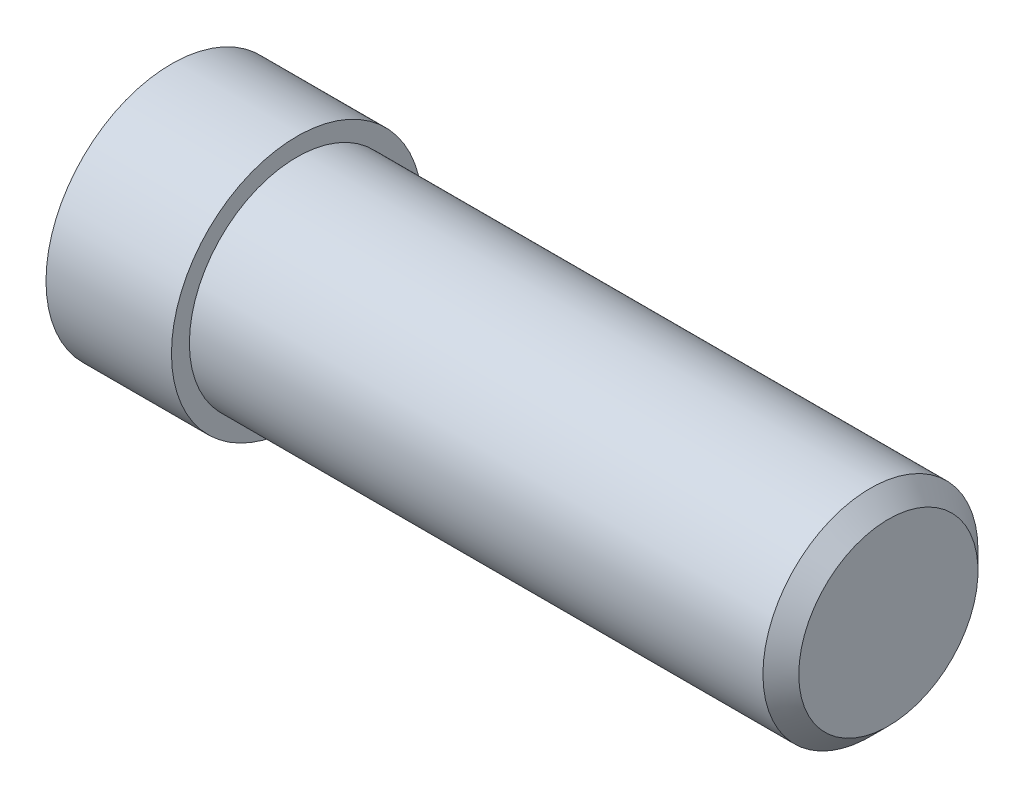
ISO-10303-21;
HEADER;
FILE_DESCRIPTION(('STEP AP214'),'2;1');
FILE_NAME('part.step','',(''),(''),'','','');
FILE_SCHEMA(('AUTOMOTIVE_DESIGN { 1 0 10303 214 1 1 1 1 }'));
ENDSEC;
DATA;
#1=APPLICATION_CONTEXT('core data for automotive mechanical design processes');
#2=APPLICATION_PROTOCOL_DEFINITION('international standard','automotive_design',2000,#1);
#3=PRODUCT_CONTEXT('',#1,'mechanical');
#4=PRODUCT('Part','Part','',(#3));
#5=PRODUCT_RELATED_PRODUCT_CATEGORY('part','',(#4));
#6=PRODUCT_DEFINITION_FORMATION('','',#4);
#7=PRODUCT_DEFINITION_CONTEXT('part definition',#1,'design');
#8=PRODUCT_DEFINITION('design','',#6,#7);
#9=PRODUCT_DEFINITION_SHAPE('','',#8);
#10=(LENGTH_UNIT() NAMED_UNIT(*) SI_UNIT(.MILLI.,.METRE.));
#11=(NAMED_UNIT(*) PLANE_ANGLE_UNIT() SI_UNIT($,.RADIAN.));
#12=(NAMED_UNIT(*) SI_UNIT($,.STERADIAN.) SOLID_ANGLE_UNIT());
#13=UNCERTAINTY_MEASURE_WITH_UNIT(LENGTH_MEASURE(1.E-05),#10,'distance_accuracy_value','');
#14=(GEOMETRIC_REPRESENTATION_CONTEXT(3) GLOBAL_UNCERTAINTY_ASSIGNED_CONTEXT((#13)) GLOBAL_UNIT_ASSIGNED_CONTEXT((#10,
#11,#12)) REPRESENTATION_CONTEXT('',''));
#15=CARTESIAN_POINT('',(0.,0.,0.));
#16=DIRECTION('',(0.,0.,1.));
#17=DIRECTION('',(1.,0.,0.));
#18=AXIS2_PLACEMENT_3D('',#15,#16,#17);
#19=CARTESIAN_POINT('',(0.,0.,0.));
#20=DIRECTION('',(-1.,0.,0.));
#21=DIRECTION('',(0.,0.,1.));
#22=AXIS2_PLACEMENT_3D('',#19,#20,#21);
#23=CYLINDRICAL_SURFACE('',#22,7.);
#24=CARTESIAN_POINT('',(0.,0.,0.));
#25=DIRECTION('',(-1.,0.,0.));
#26=DIRECTION('',(0.,0.,1.));
#27=AXIS2_PLACEMENT_3D('',#24,#25,#26);
#28=CIRCLE('',#27,7.);
#29=CARTESIAN_POINT('',(0.,0.,7.));
#30=VERTEX_POINT('',#29);
#31=EDGE_CURVE('E53',#30,#30,#28,.T.);
#32=ORIENTED_EDGE('',*,*,#31,.F.);
#33=EDGE_LOOP('',(#32));
#34=FACE_BOUND('',#33,.T.);
#35=CARTESIAN_POINT('',(7.,0.,0.));
#36=DIRECTION('',(-1.,0.,0.));
#37=DIRECTION('',(0.,0.,1.));
#38=AXIS2_PLACEMENT_3D('',#35,#36,#37);
#39=CIRCLE('',#38,7.);
#40=CARTESIAN_POINT('',(7.,0.,7.));
#41=VERTEX_POINT('',#40);
#42=EDGE_CURVE('E62',#41,#41,#39,.T.);
#43=ORIENTED_EDGE('',*,*,#42,.T.);
#44=EDGE_LOOP('',(#43));
#45=FACE_BOUND('',#44,.T.);
#46=ADVANCED_FACE('F41',(#34,#45),#23,.T.);
#47=CARTESIAN_POINT('',(0.,0.,-7.));
#48=DIRECTION('',(1.,0.,0.));
#49=DIRECTION('',(0.,0.,-1.));
#50=AXIS2_PLACEMENT_3D('',#47,#48,#49);
#51=PLANE('',#50);
#52=ORIENTED_EDGE('',*,*,#31,.T.);
#53=EDGE_LOOP('',(#52));
#54=FACE_BOUND('',#53,.T.);
#55=ADVANCED_FACE('F81',(#54),#51,.F.);
#56=CARTESIAN_POINT('',(40.,0.,0.));
#57=DIRECTION('',(-1.,0.,0.));
#58=DIRECTION('',(0.,0.,1.));
#59=AXIS2_PLACEMENT_3D('',#56,#57,#58);
#60=PLANE('',#59);
#61=CARTESIAN_POINT('',(40.,0.,0.));
#62=DIRECTION('',(-1.,0.,0.));
#63=DIRECTION('',(0.,0.,1.));
#64=AXIS2_PLACEMENT_3D('',#61,#62,#63);
#65=CIRCLE('',#64,4.99999999999999);
#66=CARTESIAN_POINT('',(40.,0.,4.99999999999999));
#67=VERTEX_POINT('',#66);
#68=EDGE_CURVE('E10',#67,#67,#65,.F.);
#69=ORIENTED_EDGE('',*,*,#68,.T.);
#70=EDGE_LOOP('',(#69));
#71=FACE_BOUND('',#70,.T.);
#72=ADVANCED_FACE('F75',(#71),#60,.F.);
#73=CARTESIAN_POINT('',(0.,0.,0.));
#74=DIRECTION('',(-1.,0.,0.));
#75=DIRECTION('',(0.,0.,1.));
#76=AXIS2_PLACEMENT_3D('',#73,#74,#75);
#77=CYLINDRICAL_SURFACE('',#76,6.);
#78=CARTESIAN_POINT('',(39.,0.,0.));
#79=DIRECTION('',(-1.,0.,0.));
#80=DIRECTION('',(0.,0.,1.));
#81=AXIS2_PLACEMENT_3D('',#78,#79,#80);
#82=CIRCLE('',#81,6.);
#83=CARTESIAN_POINT('',(39.,0.,6.));
#84=VERTEX_POINT('',#83);
#85=EDGE_CURVE('E49',#84,#84,#82,.T.);
#86=ORIENTED_EDGE('',*,*,#85,.T.);
#87=EDGE_LOOP('',(#86));
#88=FACE_BOUND('',#87,.T.);
#89=CARTESIAN_POINT('',(7.,0.,0.));
#90=DIRECTION('',(-1.,0.,0.));
#91=DIRECTION('',(0.,0.,1.));
#92=AXIS2_PLACEMENT_3D('',#89,#90,#91);
#93=CIRCLE('',#92,5.99999999999999);
#94=CARTESIAN_POINT('',(7.,0.,5.99999999999999));
#95=VERTEX_POINT('',#94);
#96=EDGE_CURVE('E57',#95,#95,#93,.T.);
#97=ORIENTED_EDGE('',*,*,#96,.F.);
#98=EDGE_LOOP('',(#97));
#99=FACE_BOUND('',#98,.T.);
#100=ADVANCED_FACE('F70',(#88,#99),#77,.T.);
#101=CARTESIAN_POINT('',(7.,0.,-5.99999999999999));
#102=DIRECTION('',(-1.,0.,0.));
#103=DIRECTION('',(0.,0.,1.));
#104=AXIS2_PLACEMENT_3D('',#101,#102,#103);
#105=PLANE('',#104);
#106=ORIENTED_EDGE('',*,*,#42,.F.);
#107=EDGE_LOOP('',(#106));
#108=FACE_BOUND('',#107,.T.);
#109=ORIENTED_EDGE('',*,*,#96,.T.);
#110=EDGE_LOOP('',(#109));
#111=FACE_BOUND('',#110,.T.);
#112=ADVANCED_FACE('F67',(#108,#111),#105,.F.);
#113=CARTESIAN_POINT('',(39.,0.,0.));
#114=DIRECTION('',(-1.,0.,0.));
#115=DIRECTION('',(0.,0.,1.));
#116=AXIS2_PLACEMENT_3D('',#113,#114,#115);
#117=CONICAL_SURFACE('',#116,6.,0.785398163397453);
#118=ORIENTED_EDGE('',*,*,#68,.F.);
#119=EDGE_LOOP('',(#118));
#120=FACE_BOUND('',#119,.T.);
#121=ORIENTED_EDGE('',*,*,#85,.F.);
#122=EDGE_LOOP('',(#121));
#123=FACE_BOUND('',#122,.T.);
#124=ADVANCED_FACE('F44',(#120,#123),#117,.T.);
#125=CLOSED_SHELL('',(#46,#55,#72,#100,#112,#124));
#126=MANIFOLD_SOLID_BREP('B2',#125);
#127=ADVANCED_BREP_SHAPE_REPRESENTATION('',(#18,#126),#14);
#128=SHAPE_DEFINITION_REPRESENTATION(#9,#127);
ENDSEC;
END-ISO-10303-21;
